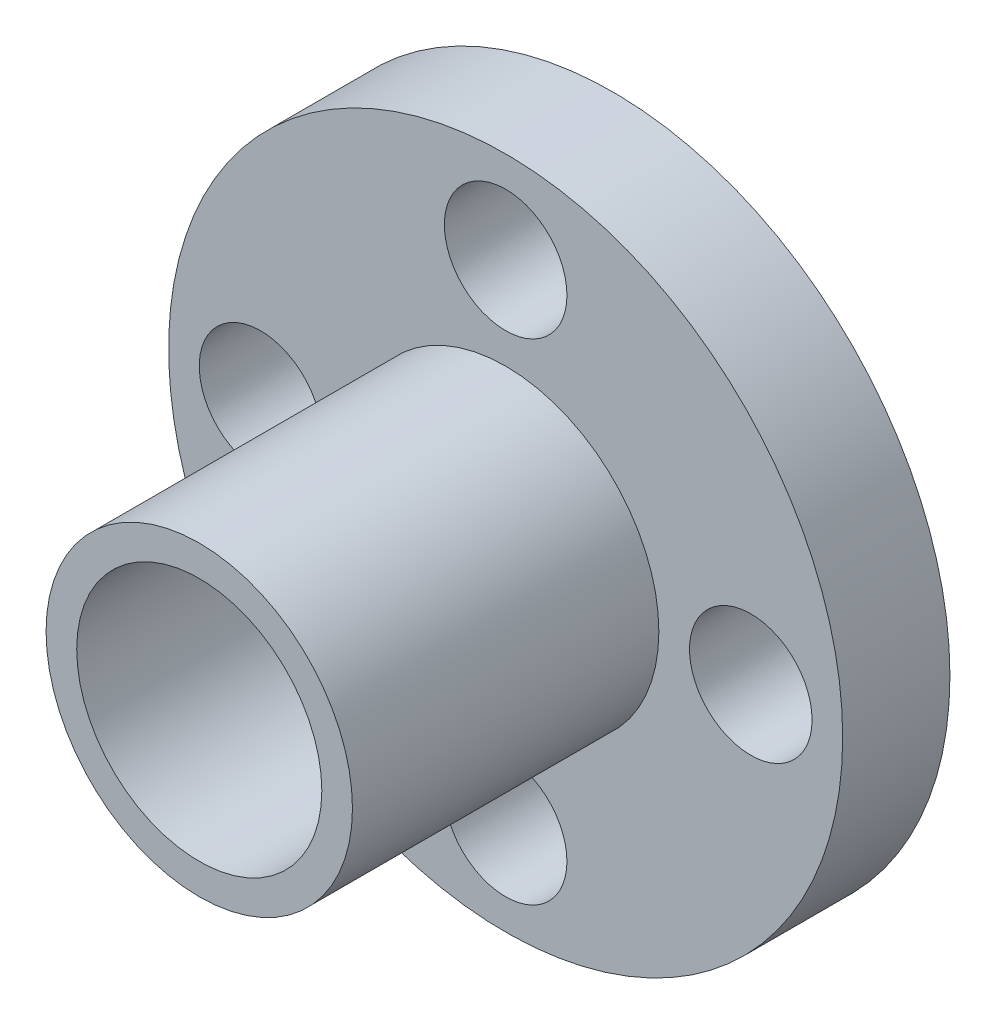
ISO-10303-21;
HEADER;
FILE_DESCRIPTION(('STEP AP214'),'2;1');
FILE_NAME('part.step','',(''),(''),'','','');
FILE_SCHEMA(('AUTOMOTIVE_DESIGN { 1 0 10303 214 1 1 1 1 }'));
ENDSEC;
DATA;
#1=APPLICATION_CONTEXT('core data for automotive mechanical design processes');
#2=APPLICATION_PROTOCOL_DEFINITION('international standard','automotive_design',2000,#1);
#3=PRODUCT_CONTEXT('',#1,'mechanical');
#4=PRODUCT('Part','Part','',(#3));
#5=PRODUCT_RELATED_PRODUCT_CATEGORY('part','',(#4));
#6=PRODUCT_DEFINITION_FORMATION('','',#4);
#7=PRODUCT_DEFINITION_CONTEXT('part definition',#1,'design');
#8=PRODUCT_DEFINITION('design','',#6,#7);
#9=PRODUCT_DEFINITION_SHAPE('','',#8);
#10=(LENGTH_UNIT() NAMED_UNIT(*) SI_UNIT(.MILLI.,.METRE.));
#11=(NAMED_UNIT(*) PLANE_ANGLE_UNIT() SI_UNIT($,.RADIAN.));
#12=(NAMED_UNIT(*) SI_UNIT($,.STERADIAN.) SOLID_ANGLE_UNIT());
#13=UNCERTAINTY_MEASURE_WITH_UNIT(LENGTH_MEASURE(1.E-05),#10,'distance_accuracy_value','');
#14=(GEOMETRIC_REPRESENTATION_CONTEXT(3) GLOBAL_UNCERTAINTY_ASSIGNED_CONTEXT((#13)) GLOBAL_UNIT_ASSIGNED_CONTEXT((#10,
#11,#12)) REPRESENTATION_CONTEXT('',''));
#15=CARTESIAN_POINT('',(0.,0.,0.));
#16=DIRECTION('',(0.,0.,1.));
#17=DIRECTION('',(1.,0.,0.));
#18=AXIS2_PLACEMENT_3D('',#15,#16,#17);
#19=CARTESIAN_POINT('',(0.,0.,15.));
#20=DIRECTION('',(0.,0.,-1.));
#21=DIRECTION('',(-1.,0.,0.));
#22=AXIS2_PLACEMENT_3D('',#19,#20,#21);
#23=CYLINDRICAL_SURFACE('',#22,5.);
#24=CARTESIAN_POINT('',(0.,0.,0.));
#25=DIRECTION('',(0.,0.,1.));
#26=DIRECTION('',(1.,0.,0.));
#27=AXIS2_PLACEMENT_3D('',#24,#25,#26);
#28=CIRCLE('',#27,5.);
#29=CARTESIAN_POINT('',(5.,0.,0.));
#30=VERTEX_POINT('',#29);
#31=EDGE_CURVE('E48',#30,#30,#28,.T.);
#32=ORIENTED_EDGE('',*,*,#31,.T.);
#33=EDGE_LOOP('',(#32));
#34=FACE_BOUND('',#33,.T.);
#35=CARTESIAN_POINT('',(0.,0.,1.5));
#36=DIRECTION('',(0.,0.,1.));
#37=DIRECTION('',(1.,0.,0.));
#38=AXIS2_PLACEMENT_3D('',#35,#36,#37);
#39=CIRCLE('',#38,5.);
#40=CARTESIAN_POINT('',(5.,0.,1.5));
#41=VERTEX_POINT('',#40);
#42=EDGE_CURVE('E10',#41,#41,#39,.T.);
#43=ORIENTED_EDGE('',*,*,#42,.F.);
#44=EDGE_LOOP('',(#43));
#45=FACE_BOUND('',#44,.T.);
#46=ADVANCED_FACE('F35',(#34,#45),#23,.T.);
#47=CARTESIAN_POINT('',(0.,0.,15.));
#48=DIRECTION('',(0.,0.,1.));
#49=DIRECTION('',(1.,0.,0.));
#50=AXIS2_PLACEMENT_3D('',#47,#48,#49);
#51=PLANE('',#50);
#52=CARTESIAN_POINT('',(0.,0.,15.));
#53=DIRECTION('',(0.,0.,1.));
#54=DIRECTION('',(1.,0.,0.));
#55=AXIS2_PLACEMENT_3D('',#52,#53,#54);
#56=CIRCLE('',#55,5.);
#57=CARTESIAN_POINT('',(5.,0.,15.));
#58=VERTEX_POINT('',#57);
#59=EDGE_CURVE('E43',#58,#58,#56,.T.);
#60=ORIENTED_EDGE('',*,*,#59,.T.);
#61=EDGE_LOOP('',(#60));
#62=FACE_BOUND('',#61,.T.);
#63=CARTESIAN_POINT('',(0.,0.,15.));
#64=DIRECTION('',(0.,0.,1.));
#65=DIRECTION('',(1.,0.,0.));
#66=AXIS2_PLACEMENT_3D('',#63,#64,#65);
#67=CIRCLE('',#66,4.);
#68=CARTESIAN_POINT('',(4.,0.,15.));
#69=VERTEX_POINT('',#68);
#70=EDGE_CURVE('E86',#69,#69,#67,.T.);
#71=ORIENTED_EDGE('',*,*,#70,.F.);
#72=EDGE_LOOP('',(#71));
#73=FACE_BOUND('',#72,.T.);
#74=ADVANCED_FACE('F110',(#62,#73),#51,.T.);
#75=CARTESIAN_POINT('',(0.,0.,0.));
#76=DIRECTION('',(0.,0.,1.));
#77=DIRECTION('',(1.,0.,0.));
#78=AXIS2_PLACEMENT_3D('',#75,#76,#77);
#79=PLANE('',#78);
#80=ORIENTED_EDGE('',*,*,#31,.F.);
#81=EDGE_LOOP('',(#80));
#82=FACE_BOUND('',#81,.T.);
#83=CARTESIAN_POINT('',(0.,0.,0.));
#84=DIRECTION('',(0.,0.,1.));
#85=DIRECTION('',(1.,0.,0.));
#86=AXIS2_PLACEMENT_3D('',#83,#84,#85);
#87=CIRCLE('',#86,4.);
#88=CARTESIAN_POINT('',(4.,0.,0.));
#89=VERTEX_POINT('',#88);
#90=EDGE_CURVE('E83',#89,#89,#87,.T.);
#91=ORIENTED_EDGE('',*,*,#90,.T.);
#92=EDGE_LOOP('',(#91));
#93=FACE_BOUND('',#92,.T.);
#94=ADVANCED_FACE('F92',(#82,#93),#79,.F.);
#95=CARTESIAN_POINT('',(0.,0.,5.));
#96=DIRECTION('',(0.,0.,1.));
#97=DIRECTION('',(1.,0.,0.));
#98=AXIS2_PLACEMENT_3D('',#95,#96,#97);
#99=CIRCLE('',#98,5.);
#100=CARTESIAN_POINT('',(5.,0.,5.));
#101=VERTEX_POINT('',#100);
#102=EDGE_CURVE('E76',#101,#101,#99,.T.);
#103=ORIENTED_EDGE('',*,*,#102,.T.);
#104=EDGE_LOOP('',(#103));
#105=FACE_BOUND('',#104,.T.);
#106=ORIENTED_EDGE('',*,*,#59,.F.);
#107=EDGE_LOOP('',(#106));
#108=FACE_BOUND('',#107,.T.);
#109=ADVANCED_FACE('F37',(#105,#108),#23,.T.);
#110=CARTESIAN_POINT('',(0.,0.,15.));
#111=DIRECTION('',(0.,0.,-1.));
#112=DIRECTION('',(-1.,0.,0.));
#113=AXIS2_PLACEMENT_3D('',#110,#111,#112);
#114=CYLINDRICAL_SURFACE('',#113,4.);
#115=ORIENTED_EDGE('',*,*,#70,.T.);
#116=EDGE_LOOP('',(#115));
#117=FACE_BOUND('',#116,.T.);
#118=ORIENTED_EDGE('',*,*,#90,.F.);
#119=EDGE_LOOP('',(#118));
#120=FACE_BOUND('',#119,.T.);
#121=ADVANCED_FACE('F94',(#117,#120),#114,.F.);
#122=CARTESIAN_POINT('',(0.,0.,5.));
#123=DIRECTION('',(0.,0.,1.));
#124=DIRECTION('',(1.,0.,0.));
#125=AXIS2_PLACEMENT_3D('',#122,#123,#124);
#126=PLANE('',#125);
#127=CARTESIAN_POINT('',(8.,0.,5.));
#128=DIRECTION('',(0.,0.,1.));
#129=DIRECTION('',(1.,0.,0.));
#130=AXIS2_PLACEMENT_3D('',#127,#128,#129);
#131=CIRCLE('',#130,2.);
#132=CARTESIAN_POINT('',(10.,0.,5.));
#133=VERTEX_POINT('',#132);
#134=EDGE_CURVE('E56',#133,#133,#131,.F.);
#135=ORIENTED_EDGE('',*,*,#134,.T.);
#136=EDGE_LOOP('',(#135));
#137=FACE_BOUND('',#136,.T.);
#138=CARTESIAN_POINT('',(0.,-8.,5.));
#139=DIRECTION('',(0.,0.,1.));
#140=DIRECTION('',(1.,0.,0.));
#141=AXIS2_PLACEMENT_3D('',#138,#139,#140);
#142=CIRCLE('',#141,2.);
#143=CARTESIAN_POINT('',(2.,-8.,5.));
#144=VERTEX_POINT('',#143);
#145=EDGE_CURVE('E62',#144,#144,#142,.F.);
#146=ORIENTED_EDGE('',*,*,#145,.T.);
#147=EDGE_LOOP('',(#146));
#148=FACE_BOUND('',#147,.T.);
#149=CARTESIAN_POINT('',(-8.,0.,5.));
#150=DIRECTION('',(0.,0.,1.));
#151=DIRECTION('',(1.,0.,0.));
#152=AXIS2_PLACEMENT_3D('',#149,#150,#151);
#153=CIRCLE('',#152,2.);
#154=CARTESIAN_POINT('',(-6.,0.,5.));
#155=VERTEX_POINT('',#154);
#156=EDGE_CURVE('E59',#155,#155,#153,.F.);
#157=ORIENTED_EDGE('',*,*,#156,.T.);
#158=EDGE_LOOP('',(#157));
#159=FACE_BOUND('',#158,.T.);
#160=CARTESIAN_POINT('',(0.,8.,5.));
#161=DIRECTION('',(0.,0.,1.));
#162=DIRECTION('',(1.,0.,0.));
#163=AXIS2_PLACEMENT_3D('',#160,#161,#162);
#164=CIRCLE('',#163,2.);
#165=CARTESIAN_POINT('',(2.,8.,5.));
#166=VERTEX_POINT('',#165);
#167=EDGE_CURVE('E55',#166,#166,#164,.F.);
#168=ORIENTED_EDGE('',*,*,#167,.T.);
#169=EDGE_LOOP('',(#168));
#170=FACE_BOUND('',#169,.T.);
#171=CARTESIAN_POINT('',(0.,0.,5.));
#172=DIRECTION('',(0.,0.,1.));
#173=DIRECTION('',(1.,0.,0.));
#174=AXIS2_PLACEMENT_3D('',#171,#172,#173);
#175=CIRCLE('',#174,11.);
#176=CARTESIAN_POINT('',(11.,0.,5.));
#177=VERTEX_POINT('',#176);
#178=EDGE_CURVE('E80',#177,#177,#175,.T.);
#179=ORIENTED_EDGE('',*,*,#178,.T.);
#180=EDGE_LOOP('',(#179));
#181=FACE_BOUND('',#180,.T.);
#182=ORIENTED_EDGE('',*,*,#102,.F.);
#183=EDGE_LOOP('',(#182));
#184=FACE_BOUND('',#183,.T.);
#185=ADVANCED_FACE('F96',(#137,#148,#159,#170,#181,#184),#126,.T.);
#186=CARTESIAN_POINT('',(0.,0.,1.5));
#187=DIRECTION('',(0.,0.,1.));
#188=DIRECTION('',(1.,0.,0.));
#189=AXIS2_PLACEMENT_3D('',#186,#187,#188);
#190=PLANE('',#189);
#191=CARTESIAN_POINT('',(8.,0.,1.5));
#192=DIRECTION('',(0.,0.,1.));
#193=DIRECTION('',(1.,0.,0.));
#194=AXIS2_PLACEMENT_3D('',#191,#192,#193);
#195=CIRCLE('',#194,2.);
#196=CARTESIAN_POINT('',(10.,0.,1.5));
#197=VERTEX_POINT('',#196);
#198=EDGE_CURVE('E39',#197,#197,#195,.F.);
#199=ORIENTED_EDGE('',*,*,#198,.F.);
#200=EDGE_LOOP('',(#199));
#201=FACE_BOUND('',#200,.T.);
#202=CARTESIAN_POINT('',(0.,-8.,1.5));
#203=DIRECTION('',(0.,0.,1.));
#204=DIRECTION('',(1.,0.,0.));
#205=AXIS2_PLACEMENT_3D('',#202,#203,#204);
#206=CIRCLE('',#205,2.);
#207=CARTESIAN_POINT('',(2.,-8.,1.5));
#208=VERTEX_POINT('',#207);
#209=EDGE_CURVE('E60',#208,#208,#206,.F.);
#210=ORIENTED_EDGE('',*,*,#209,.F.);
#211=EDGE_LOOP('',(#210));
#212=FACE_BOUND('',#211,.T.);
#213=CARTESIAN_POINT('',(-8.,0.,1.5));
#214=DIRECTION('',(0.,0.,1.));
#215=DIRECTION('',(1.,0.,0.));
#216=AXIS2_PLACEMENT_3D('',#213,#214,#215);
#217=CIRCLE('',#216,2.);
#218=CARTESIAN_POINT('',(-6.,0.,1.5));
#219=VERTEX_POINT('',#218);
#220=EDGE_CURVE('E57',#219,#219,#217,.F.);
#221=ORIENTED_EDGE('',*,*,#220,.F.);
#222=EDGE_LOOP('',(#221));
#223=FACE_BOUND('',#222,.T.);
#224=CARTESIAN_POINT('',(0.,8.,1.5));
#225=DIRECTION('',(0.,0.,1.));
#226=DIRECTION('',(1.,0.,0.));
#227=AXIS2_PLACEMENT_3D('',#224,#225,#226);
#228=CIRCLE('',#227,2.);
#229=CARTESIAN_POINT('',(2.,8.,1.5));
#230=VERTEX_POINT('',#229);
#231=EDGE_CURVE('E52',#230,#230,#228,.F.);
#232=ORIENTED_EDGE('',*,*,#231,.F.);
#233=EDGE_LOOP('',(#232));
#234=FACE_BOUND('',#233,.T.);
#235=CARTESIAN_POINT('',(0.,0.,1.5));
#236=DIRECTION('',(0.,0.,1.));
#237=DIRECTION('',(1.,0.,0.));
#238=AXIS2_PLACEMENT_3D('',#235,#236,#237);
#239=CIRCLE('',#238,11.);
#240=CARTESIAN_POINT('',(11.,0.,1.5));
#241=VERTEX_POINT('',#240);
#242=EDGE_CURVE('E79',#241,#241,#239,.T.);
#243=ORIENTED_EDGE('',*,*,#242,.F.);
#244=EDGE_LOOP('',(#243));
#245=FACE_BOUND('',#244,.T.);
#246=ORIENTED_EDGE('',*,*,#42,.T.);
#247=EDGE_LOOP('',(#246));
#248=FACE_BOUND('',#247,.T.);
#249=ADVANCED_FACE('F103',(#201,#212,#223,#234,#245,#248),#190,.F.);
#250=CARTESIAN_POINT('',(0.,0.,5.));
#251=DIRECTION('',(0.,0.,-1.));
#252=DIRECTION('',(-1.,0.,0.));
#253=AXIS2_PLACEMENT_3D('',#250,#251,#252);
#254=CYLINDRICAL_SURFACE('',#253,11.);
#255=ORIENTED_EDGE('',*,*,#178,.F.);
#256=EDGE_LOOP('',(#255));
#257=FACE_BOUND('',#256,.T.);
#258=ORIENTED_EDGE('',*,*,#242,.T.);
#259=EDGE_LOOP('',(#258));
#260=FACE_BOUND('',#259,.T.);
#261=ADVANCED_FACE('F138',(#257,#260),#254,.T.);
#262=CARTESIAN_POINT('',(0.,8.,15.));
#263=DIRECTION('',(0.,0.,-1.));
#264=DIRECTION('',(-1.,0.,0.));
#265=AXIS2_PLACEMENT_3D('',#262,#263,#264);
#266=CYLINDRICAL_SURFACE('',#265,2.);
#267=ORIENTED_EDGE('',*,*,#167,.F.);
#268=EDGE_LOOP('',(#267));
#269=FACE_BOUND('',#268,.T.);
#270=ORIENTED_EDGE('',*,*,#231,.T.);
#271=EDGE_LOOP('',(#270));
#272=FACE_BOUND('',#271,.T.);
#273=ADVANCED_FACE('F143',(#269,#272),#266,.F.);
#274=CARTESIAN_POINT('',(-8.,0.,15.));
#275=DIRECTION('',(0.,0.,-1.));
#276=DIRECTION('',(-1.,0.,0.));
#277=AXIS2_PLACEMENT_3D('',#274,#275,#276);
#278=CYLINDRICAL_SURFACE('',#277,2.);
#279=ORIENTED_EDGE('',*,*,#156,.F.);
#280=EDGE_LOOP('',(#279));
#281=FACE_BOUND('',#280,.T.);
#282=ORIENTED_EDGE('',*,*,#220,.T.);
#283=EDGE_LOOP('',(#282));
#284=FACE_BOUND('',#283,.T.);
#285=ADVANCED_FACE('F155',(#281,#284),#278,.F.);
#286=CARTESIAN_POINT('',(0.,-8.,15.));
#287=DIRECTION('',(0.,0.,-1.));
#288=DIRECTION('',(-1.,0.,0.));
#289=AXIS2_PLACEMENT_3D('',#286,#287,#288);
#290=CYLINDRICAL_SURFACE('',#289,2.);
#291=ORIENTED_EDGE('',*,*,#145,.F.);
#292=EDGE_LOOP('',(#291));
#293=FACE_BOUND('',#292,.T.);
#294=ORIENTED_EDGE('',*,*,#209,.T.);
#295=EDGE_LOOP('',(#294));
#296=FACE_BOUND('',#295,.T.);
#297=ADVANCED_FACE('F182',(#293,#296),#290,.F.);
#298=CARTESIAN_POINT('',(8.,0.,15.));
#299=DIRECTION('',(0.,0.,-1.));
#300=DIRECTION('',(-1.,0.,0.));
#301=AXIS2_PLACEMENT_3D('',#298,#299,#300);
#302=CYLINDRICAL_SURFACE('',#301,2.);
#303=ORIENTED_EDGE('',*,*,#134,.F.);
#304=EDGE_LOOP('',(#303));
#305=FACE_BOUND('',#304,.T.);
#306=ORIENTED_EDGE('',*,*,#198,.T.);
#307=EDGE_LOOP('',(#306));
#308=FACE_BOUND('',#307,.T.);
#309=ADVANCED_FACE('F193',(#305,#308),#302,.F.);
#310=CLOSED_SHELL('',(#46,#74,#94,#109,#121,#185,#249,#261,#273,#285,#297,#309));
#311=MANIFOLD_SOLID_BREP('B2',#310);
#312=ADVANCED_BREP_SHAPE_REPRESENTATION('',(#18,#311),#14);
#313=SHAPE_DEFINITION_REPRESENTATION(#9,#312);
ENDSEC;
END-ISO-10303-21;
